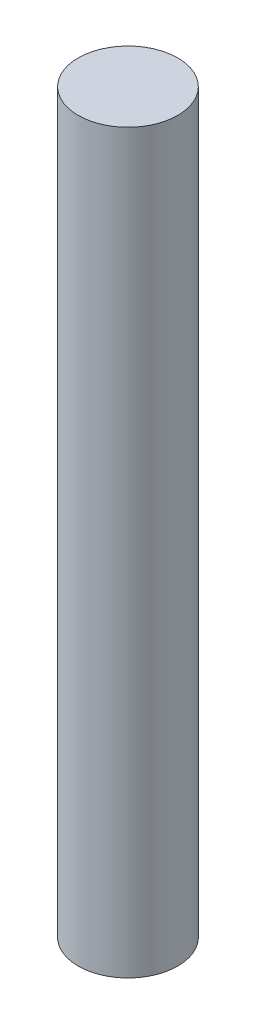
ISO-10303-21;
HEADER;
FILE_DESCRIPTION(('STEP AP214'),'2;1');
FILE_NAME('part.step','',(''),(''),'','','');
FILE_SCHEMA(('AUTOMOTIVE_DESIGN { 1 0 10303 214 1 1 1 1 }'));
ENDSEC;
DATA;
#1=APPLICATION_CONTEXT('core data for automotive mechanical design processes');
#2=APPLICATION_PROTOCOL_DEFINITION('international standard','automotive_design',2000,#1);
#3=PRODUCT_CONTEXT('',#1,'mechanical');
#4=PRODUCT('Part','Part','',(#3));
#5=PRODUCT_RELATED_PRODUCT_CATEGORY('part','',(#4));
#6=PRODUCT_DEFINITION_FORMATION('','',#4);
#7=PRODUCT_DEFINITION_CONTEXT('part definition',#1,'design');
#8=PRODUCT_DEFINITION('design','',#6,#7);
#9=PRODUCT_DEFINITION_SHAPE('','',#8);
#10=(LENGTH_UNIT() NAMED_UNIT(*) SI_UNIT(.MILLI.,.METRE.));
#11=(NAMED_UNIT(*) PLANE_ANGLE_UNIT() SI_UNIT($,.RADIAN.));
#12=(NAMED_UNIT(*) SI_UNIT($,.STERADIAN.) SOLID_ANGLE_UNIT());
#13=UNCERTAINTY_MEASURE_WITH_UNIT(LENGTH_MEASURE(1.E-05),#10,'distance_accuracy_value','');
#14=(GEOMETRIC_REPRESENTATION_CONTEXT(3) GLOBAL_UNCERTAINTY_ASSIGNED_CONTEXT((#13)) GLOBAL_UNIT_ASSIGNED_CONTEXT((#10,
#11,#12)) REPRESENTATION_CONTEXT('',''));
#15=CARTESIAN_POINT('',(0.,0.,0.));
#16=DIRECTION('',(0.,0.,1.));
#17=DIRECTION('',(1.,0.,0.));
#18=AXIS2_PLACEMENT_3D('',#15,#16,#17);
#19=CARTESIAN_POINT('',(0.,37.,0.));
#20=DIRECTION('',(0.,-1.,0.));
#21=DIRECTION('',(0.,0.,-1.));
#22=AXIS2_PLACEMENT_3D('',#19,#20,#21);
#23=CYLINDRICAL_SURFACE('',#22,2.5);
#24=CARTESIAN_POINT('',(0.,37.,0.));
#25=DIRECTION('',(0.,1.,0.));
#26=DIRECTION('',(0.,0.,1.));
#27=AXIS2_PLACEMENT_3D('',#24,#25,#26);
#28=CIRCLE('',#27,2.5);
#29=CARTESIAN_POINT('',(0.,37.,2.5));
#30=VERTEX_POINT('',#29);
#31=EDGE_CURVE('E10',#30,#30,#28,.T.);
#32=ORIENTED_EDGE('',*,*,#31,.F.);
#33=EDGE_LOOP('',(#32));
#34=FACE_BOUND('',#33,.T.);
#35=CARTESIAN_POINT('',(0.,0.,0.));
#36=DIRECTION('',(0.,1.,0.));
#37=DIRECTION('',(0.,0.,1.));
#38=AXIS2_PLACEMENT_3D('',#35,#36,#37);
#39=CIRCLE('',#38,2.5);
#40=CARTESIAN_POINT('',(0.,0.,2.5));
#41=VERTEX_POINT('',#40);
#42=EDGE_CURVE('E37',#41,#41,#39,.T.);
#43=ORIENTED_EDGE('',*,*,#42,.T.);
#44=EDGE_LOOP('',(#43));
#45=FACE_BOUND('',#44,.T.);
#46=ADVANCED_FACE('F40',(#34,#45),#23,.T.);
#47=CARTESIAN_POINT('',(0.,37.,0.));
#48=DIRECTION('',(0.,1.,0.));
#49=DIRECTION('',(0.,0.,1.));
#50=AXIS2_PLACEMENT_3D('',#47,#48,#49);
#51=PLANE('',#50);
#52=ORIENTED_EDGE('',*,*,#31,.T.);
#53=EDGE_LOOP('',(#52));
#54=FACE_BOUND('',#53,.T.);
#55=ADVANCED_FACE('F55',(#54),#51,.T.);
#56=CARTESIAN_POINT('',(0.,0.,0.));
#57=DIRECTION('',(0.,1.,0.));
#58=DIRECTION('',(0.,0.,1.));
#59=AXIS2_PLACEMENT_3D('',#56,#57,#58);
#60=PLANE('',#59);
#61=ORIENTED_EDGE('',*,*,#42,.F.);
#62=EDGE_LOOP('',(#61));
#63=FACE_BOUND('',#62,.T.);
#64=ADVANCED_FACE('F49',(#63),#60,.F.);
#65=CLOSED_SHELL('',(#46,#55,#64));
#66=MANIFOLD_SOLID_BREP('B2',#65);
#67=ADVANCED_BREP_SHAPE_REPRESENTATION('',(#18,#66),#14);
#68=SHAPE_DEFINITION_REPRESENTATION(#9,#67);
ENDSEC;
END-ISO-10303-21;
